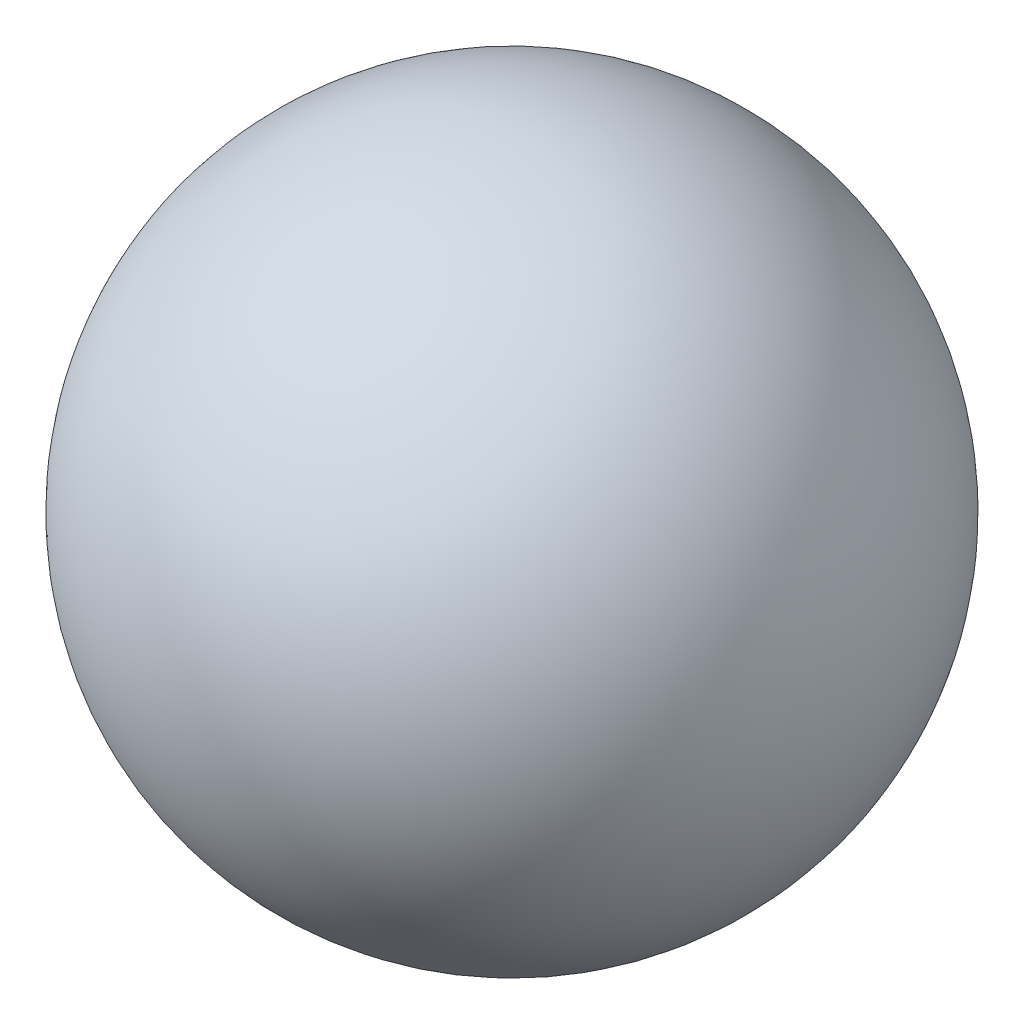
ISO-10303-21;
HEADER;
FILE_DESCRIPTION(('STEP AP214'),'2;1');
FILE_NAME('part.step','',(''),(''),'','','');
FILE_SCHEMA(('AUTOMOTIVE_DESIGN { 1 0 10303 214 1 1 1 1 }'));
ENDSEC;
DATA;
#1=APPLICATION_CONTEXT('core data for automotive mechanical design processes');
#2=APPLICATION_PROTOCOL_DEFINITION('international standard','automotive_design',2000,#1);
#3=PRODUCT_CONTEXT('',#1,'mechanical');
#4=PRODUCT('Part','Part','',(#3));
#5=PRODUCT_RELATED_PRODUCT_CATEGORY('part','',(#4));
#6=PRODUCT_DEFINITION_FORMATION('','',#4);
#7=PRODUCT_DEFINITION_CONTEXT('part definition',#1,'design');
#8=PRODUCT_DEFINITION('design','',#6,#7);
#9=PRODUCT_DEFINITION_SHAPE('','',#8);
#10=(LENGTH_UNIT() NAMED_UNIT(*) SI_UNIT(.MILLI.,.METRE.));
#11=(NAMED_UNIT(*) PLANE_ANGLE_UNIT() SI_UNIT($,.RADIAN.));
#12=(NAMED_UNIT(*) SI_UNIT($,.STERADIAN.) SOLID_ANGLE_UNIT());
#13=UNCERTAINTY_MEASURE_WITH_UNIT(LENGTH_MEASURE(1.E-05),#10,'distance_accuracy_value','');
#14=(GEOMETRIC_REPRESENTATION_CONTEXT(3) GLOBAL_UNCERTAINTY_ASSIGNED_CONTEXT((#13)) GLOBAL_UNIT_ASSIGNED_CONTEXT((#10,
#11,#12)) REPRESENTATION_CONTEXT('',''));
#15=CARTESIAN_POINT('',(0.,0.,0.));
#16=DIRECTION('',(0.,0.,1.));
#17=DIRECTION('',(1.,0.,0.));
#18=AXIS2_PLACEMENT_3D('',#15,#16,#17);
#19=CARTESIAN_POINT('',(0.,0.,0.));
#20=DIRECTION('',(-1.,0.,0.));
#21=DIRECTION('',(0.,1.,0.));
#22=AXIS2_PLACEMENT_3D('',#19,#20,#21);
#23=SPHERICAL_SURFACE('',#22,0.75);
#24=CARTESIAN_POINT('',(-0.75,0.,0.));
#25=VERTEX_POINT('',#24);
#26=VERTEX_LOOP('',#25);
#27=FACE_BOUND('',#26,.T.);
#28=ADVANCED_FACE('F29',(#27),#23,.T.);
#29=CLOSED_SHELL('',(#28));
#30=MANIFOLD_SOLID_BREP('B2',#29);
#31=ADVANCED_BREP_SHAPE_REPRESENTATION('',(#18,#30),#14);
#32=SHAPE_DEFINITION_REPRESENTATION(#9,#31);
ENDSEC;
END-ISO-10303-21;
